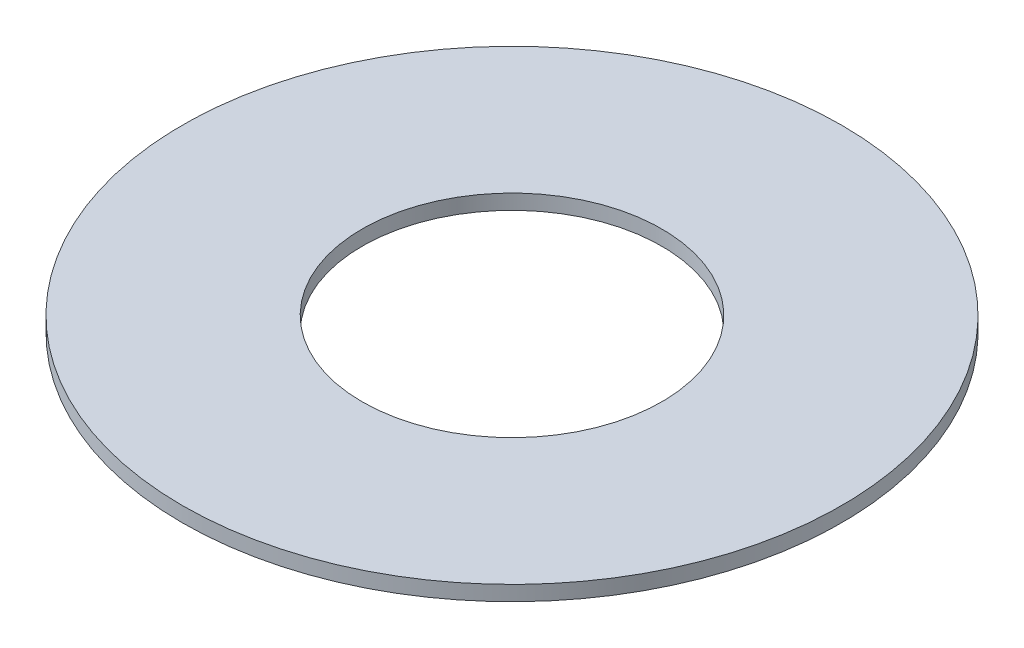
ISO-10303-21;
HEADER;
FILE_DESCRIPTION(('STEP AP214'),'2;1');
FILE_NAME('part.step','',(''),(''),'','','');
FILE_SCHEMA(('AUTOMOTIVE_DESIGN { 1 0 10303 214 1 1 1 1 }'));
ENDSEC;
DATA;
#1=APPLICATION_CONTEXT('core data for automotive mechanical design processes');
#2=APPLICATION_PROTOCOL_DEFINITION('international standard','automotive_design',2000,#1);
#3=PRODUCT_CONTEXT('',#1,'mechanical');
#4=PRODUCT('Part','Part','',(#3));
#5=PRODUCT_RELATED_PRODUCT_CATEGORY('part','',(#4));
#6=PRODUCT_DEFINITION_FORMATION('','',#4);
#7=PRODUCT_DEFINITION_CONTEXT('part definition',#1,'design');
#8=PRODUCT_DEFINITION('design','',#6,#7);
#9=PRODUCT_DEFINITION_SHAPE('','',#8);
#10=(LENGTH_UNIT() NAMED_UNIT(*) SI_UNIT(.MILLI.,.METRE.));
#11=(NAMED_UNIT(*) PLANE_ANGLE_UNIT() SI_UNIT($,.RADIAN.));
#12=(NAMED_UNIT(*) SI_UNIT($,.STERADIAN.) SOLID_ANGLE_UNIT());
#13=UNCERTAINTY_MEASURE_WITH_UNIT(LENGTH_MEASURE(1.E-05),#10,'distance_accuracy_value','');
#14=(GEOMETRIC_REPRESENTATION_CONTEXT(3) GLOBAL_UNCERTAINTY_ASSIGNED_CONTEXT((#13)) GLOBAL_UNIT_ASSIGNED_CONTEXT((#10,
#11,#12)) REPRESENTATION_CONTEXT('',''));
#15=CARTESIAN_POINT('',(0.,0.,0.));
#16=DIRECTION('',(0.,0.,1.));
#17=DIRECTION('',(1.,0.,0.));
#18=AXIS2_PLACEMENT_3D('',#15,#16,#17);
#19=CARTESIAN_POINT('',(0.,1.,0.));
#20=DIRECTION('',(0.,1.,0.));
#21=DIRECTION('',(0.,0.,1.));
#22=AXIS2_PLACEMENT_3D('',#19,#20,#21);
#23=PLANE('',#22);
#24=CARTESIAN_POINT('',(0.,1.,0.));
#25=DIRECTION('',(0.,1.,0.));
#26=DIRECTION('',(0.,0.,1.));
#27=AXIS2_PLACEMENT_3D('',#24,#25,#26);
#28=CIRCLE('',#27,22.);
#29=CARTESIAN_POINT('',(0.,1.,22.));
#30=VERTEX_POINT('',#29);
#31=EDGE_CURVE('E10',#30,#30,#28,.T.);
#32=ORIENTED_EDGE('',*,*,#31,.T.);
#33=EDGE_LOOP('',(#32));
#34=FACE_BOUND('',#33,.T.);
#35=CARTESIAN_POINT('',(0.,1.,0.));
#36=DIRECTION('',(0.,1.,0.));
#37=DIRECTION('',(0.,0.,1.));
#38=AXIS2_PLACEMENT_3D('',#35,#36,#37);
#39=CIRCLE('',#38,10.);
#40=CARTESIAN_POINT('',(0.,1.,10.));
#41=VERTEX_POINT('',#40);
#42=EDGE_CURVE('E44',#41,#41,#39,.T.);
#43=ORIENTED_EDGE('',*,*,#42,.F.);
#44=EDGE_LOOP('',(#43));
#45=FACE_BOUND('',#44,.T.);
#46=ADVANCED_FACE('F33',(#34,#45),#23,.T.);
#47=CARTESIAN_POINT('',(0.,0.,0.));
#48=DIRECTION('',(0.,1.,0.));
#49=DIRECTION('',(0.,0.,1.));
#50=AXIS2_PLACEMENT_3D('',#47,#48,#49);
#51=PLANE('',#50);
#52=CARTESIAN_POINT('',(0.,0.,0.));
#53=DIRECTION('',(0.,1.,0.));
#54=DIRECTION('',(0.,0.,1.));
#55=AXIS2_PLACEMENT_3D('',#52,#53,#54);
#56=CIRCLE('',#55,22.);
#57=CARTESIAN_POINT('',(0.,0.,22.));
#58=VERTEX_POINT('',#57);
#59=EDGE_CURVE('E37',#58,#58,#56,.T.);
#60=ORIENTED_EDGE('',*,*,#59,.F.);
#61=EDGE_LOOP('',(#60));
#62=FACE_BOUND('',#61,.T.);
#63=CARTESIAN_POINT('',(0.,0.,0.));
#64=DIRECTION('',(0.,1.,0.));
#65=DIRECTION('',(0.,0.,1.));
#66=AXIS2_PLACEMENT_3D('',#63,#64,#65);
#67=CIRCLE('',#66,10.);
#68=CARTESIAN_POINT('',(0.,0.,10.));
#69=VERTEX_POINT('',#68);
#70=EDGE_CURVE('E46',#69,#69,#67,.T.);
#71=ORIENTED_EDGE('',*,*,#70,.T.);
#72=EDGE_LOOP('',(#71));
#73=FACE_BOUND('',#72,.T.);
#74=ADVANCED_FACE('F56',(#62,#73),#51,.F.);
#75=CARTESIAN_POINT('',(0.,1.,0.));
#76=DIRECTION('',(0.,-1.,0.));
#77=DIRECTION('',(0.,0.,-1.));
#78=AXIS2_PLACEMENT_3D('',#75,#76,#77);
#79=CYLINDRICAL_SURFACE('',#78,22.);
#80=ORIENTED_EDGE('',*,*,#31,.F.);
#81=EDGE_LOOP('',(#80));
#82=FACE_BOUND('',#81,.T.);
#83=ORIENTED_EDGE('',*,*,#59,.T.);
#84=EDGE_LOOP('',(#83));
#85=FACE_BOUND('',#84,.T.);
#86=ADVANCED_FACE('F35',(#82,#85),#79,.T.);
#87=CARTESIAN_POINT('',(0.,1.,0.));
#88=DIRECTION('',(0.,-1.,0.));
#89=DIRECTION('',(0.,0.,-1.));
#90=AXIS2_PLACEMENT_3D('',#87,#88,#89);
#91=CYLINDRICAL_SURFACE('',#90,10.);
#92=ORIENTED_EDGE('',*,*,#42,.T.);
#93=EDGE_LOOP('',(#92));
#94=FACE_BOUND('',#93,.T.);
#95=ORIENTED_EDGE('',*,*,#70,.F.);
#96=EDGE_LOOP('',(#95));
#97=FACE_BOUND('',#96,.T.);
#98=ADVANCED_FACE('F52',(#94,#97),#91,.F.);
#99=CLOSED_SHELL('',(#46,#74,#86,#98));
#100=MANIFOLD_SOLID_BREP('B2',#99);
#101=ADVANCED_BREP_SHAPE_REPRESENTATION('',(#18,#100),#14);
#102=SHAPE_DEFINITION_REPRESENTATION(#9,#101);
ENDSEC;
END-ISO-10303-21;
